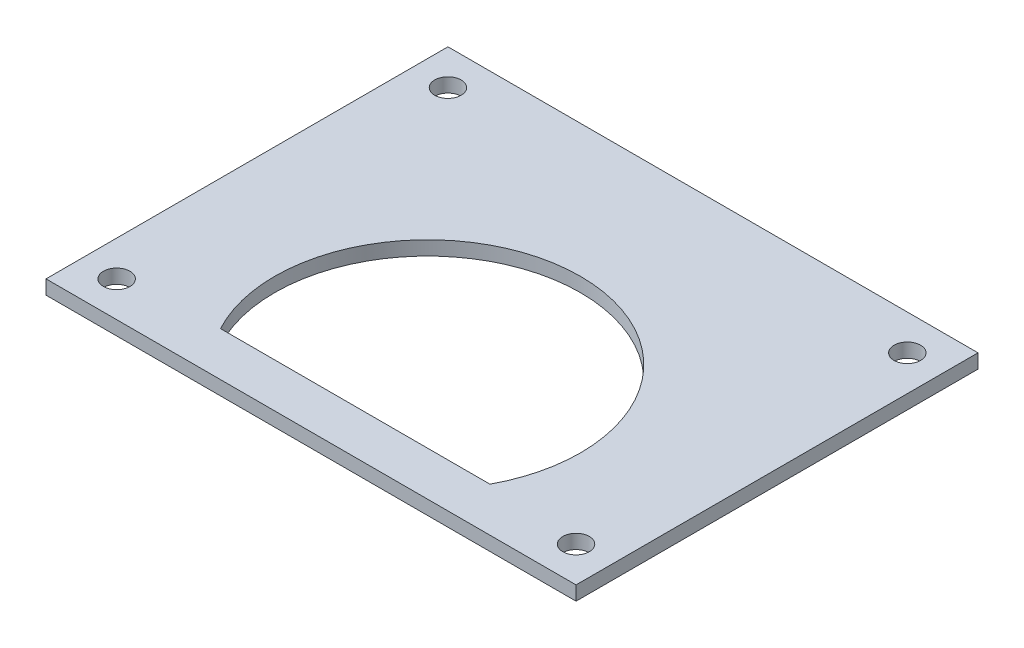
ISO-10303-21;
HEADER;
FILE_DESCRIPTION(('STEP AP214'),'2;1');
FILE_NAME('part.step','',(''),(''),'','','');
FILE_SCHEMA(('AUTOMOTIVE_DESIGN { 1 0 10303 214 1 1 1 1 }'));
ENDSEC;
DATA;
#1=APPLICATION_CONTEXT('core data for automotive mechanical design processes');
#2=APPLICATION_PROTOCOL_DEFINITION('international standard','automotive_design',2000,#1);
#3=PRODUCT_CONTEXT('',#1,'mechanical');
#4=PRODUCT('Part','Part','',(#3));
#5=PRODUCT_RELATED_PRODUCT_CATEGORY('part','',(#4));
#6=PRODUCT_DEFINITION_FORMATION('','',#4);
#7=PRODUCT_DEFINITION_CONTEXT('part definition',#1,'design');
#8=PRODUCT_DEFINITION('design','',#6,#7);
#9=PRODUCT_DEFINITION_SHAPE('','',#8);
#10=(LENGTH_UNIT() NAMED_UNIT(*) SI_UNIT(.MILLI.,.METRE.));
#11=(NAMED_UNIT(*) PLANE_ANGLE_UNIT() SI_UNIT($,.RADIAN.));
#12=(NAMED_UNIT(*) SI_UNIT($,.STERADIAN.) SOLID_ANGLE_UNIT());
#13=UNCERTAINTY_MEASURE_WITH_UNIT(LENGTH_MEASURE(1.E-05),#10,'distance_accuracy_value','');
#14=(GEOMETRIC_REPRESENTATION_CONTEXT(3) GLOBAL_UNCERTAINTY_ASSIGNED_CONTEXT((#13)) GLOBAL_UNIT_ASSIGNED_CONTEXT((#10,
#11,#12)) REPRESENTATION_CONTEXT('',''));
#15=CARTESIAN_POINT('',(0.,0.,0.));
#16=DIRECTION('',(0.,0.,1.));
#17=DIRECTION('',(1.,0.,0.));
#18=AXIS2_PLACEMENT_3D('',#15,#16,#17);
#19=CARTESIAN_POINT('',(0.,1.6,0.));
#20=DIRECTION('',(0.,-1.,0.));
#21=DIRECTION('',(0.,0.,-1.));
#22=AXIS2_PLACEMENT_3D('',#19,#20,#21);
#23=PLANE('',#22);
#24=DIRECTION('',(0.,0.,-1.));
#25=VECTOR('',#24,1.);
#26=CARTESIAN_POINT('',(30.,1.6,13.1899509803922));
#27=LINE('',#26,#25);
#28=CARTESIAN_POINT('',(30.,1.6,13.1899509803922));
#29=VERTEX_POINT('',#28);
#30=CARTESIAN_POINT('',(30.,1.6,-32.3100490196078));
#31=VERTEX_POINT('',#30);
#32=EDGE_CURVE('E107',#29,#31,#27,.T.);
#33=ORIENTED_EDGE('',*,*,#32,.T.);
#34=DIRECTION('',(-1.,0.,0.));
#35=VECTOR('',#34,1.);
#36=CARTESIAN_POINT('',(-30.,1.6,-32.3100490196078));
#37=LINE('',#36,#35);
#38=CARTESIAN_POINT('',(-30.,1.6,-32.3100490196078));
#39=VERTEX_POINT('',#38);
#40=EDGE_CURVE('E110',#31,#39,#37,.T.);
#41=ORIENTED_EDGE('',*,*,#40,.T.);
#42=DIRECTION('',(0.,0.,1.));
#43=VECTOR('',#42,1.);
#44=CARTESIAN_POINT('',(-30.,1.6,13.1899509803922));
#45=LINE('',#44,#43);
#46=CARTESIAN_POINT('',(-30.,1.6,13.1899509803922));
#47=VERTEX_POINT('',#46);
#48=EDGE_CURVE('E113',#39,#47,#45,.T.);
#49=ORIENTED_EDGE('',*,*,#48,.T.);
#50=DIRECTION('',(1.,0.,0.));
#51=VECTOR('',#50,1.);
#52=CARTESIAN_POINT('',(-30.,1.6,13.1899509803922));
#53=LINE('',#52,#51);
#54=EDGE_CURVE('E115',#47,#29,#53,.T.);
#55=ORIENTED_EDGE('',*,*,#54,.T.);
#56=EDGE_LOOP('',(#33,#41,#49,#55));
#57=FACE_BOUND('',#56,.T.);
#58=CARTESIAN_POINT('',(0.,1.6,0.));
#59=DIRECTION('',(0.,1.,0.));
#60=DIRECTION('',(0.,0.,-1.));
#61=AXIS2_PLACEMENT_3D('',#58,#59,#60);
#62=CIRCLE('',#61,17.3100490196078);
#63=CARTESIAN_POINT('',(15.25,1.6,8.18995098039215));
#64=VERTEX_POINT('',#63);
#65=CARTESIAN_POINT('',(-15.25,1.6,8.18995098039215));
#66=VERTEX_POINT('',#65);
#67=EDGE_CURVE('E91',#64,#66,#62,.T.);
#68=ORIENTED_EDGE('',*,*,#67,.F.);
#69=DIRECTION('',(1.,0.,0.));
#70=VECTOR('',#69,1.);
#71=CARTESIAN_POINT('',(-15.25,1.6,8.18995098039215));
#72=LINE('',#71,#70);
#73=EDGE_CURVE('E85',#66,#64,#72,.T.);
#74=ORIENTED_EDGE('',*,*,#73,.F.);
#75=EDGE_LOOP('',(#68,#74));
#76=FACE_BOUND('',#75,.T.);
#77=CARTESIAN_POINT('',(-26.,1.6,-28.3100490196078));
#78=DIRECTION('',(0.,1.,0.));
#79=DIRECTION('',(0.,0.,1.));
#80=AXIS2_PLACEMENT_3D('',#77,#78,#79);
#81=CIRCLE('',#80,1.5);
#82=CARTESIAN_POINT('',(-26.,1.6,-26.8100490196078));
#83=VERTEX_POINT('',#82);
#84=EDGE_CURVE('E103',#83,#83,#81,.T.);
#85=ORIENTED_EDGE('',*,*,#84,.F.);
#86=EDGE_LOOP('',(#85));
#87=FACE_BOUND('',#86,.T.);
#88=CARTESIAN_POINT('',(26.,1.6,-28.3100490196078));
#89=DIRECTION('',(0.,1.,0.));
#90=DIRECTION('',(0.,0.,1.));
#91=AXIS2_PLACEMENT_3D('',#88,#89,#90);
#92=CIRCLE('',#91,1.5);
#93=CARTESIAN_POINT('',(26.,1.6,-26.8100490196078));
#94=VERTEX_POINT('',#93);
#95=EDGE_CURVE('E212',#94,#94,#92,.T.);
#96=ORIENTED_EDGE('',*,*,#95,.F.);
#97=EDGE_LOOP('',(#96));
#98=FACE_BOUND('',#97,.T.);
#99=CARTESIAN_POINT('',(-26.,1.6,9.18995098039215));
#100=DIRECTION('',(0.,1.,0.));
#101=DIRECTION('',(0.,0.,1.));
#102=AXIS2_PLACEMENT_3D('',#99,#100,#101);
#103=CIRCLE('',#102,1.5);
#104=CARTESIAN_POINT('',(-26.,1.6,10.6899509803922));
#105=VERTEX_POINT('',#104);
#106=EDGE_CURVE('E206',#105,#105,#103,.T.);
#107=ORIENTED_EDGE('',*,*,#106,.F.);
#108=EDGE_LOOP('',(#107));
#109=FACE_BOUND('',#108,.T.);
#110=CARTESIAN_POINT('',(26.,1.6,9.18995098039215));
#111=DIRECTION('',(0.,1.,0.));
#112=DIRECTION('',(0.,0.,1.));
#113=AXIS2_PLACEMENT_3D('',#110,#111,#112);
#114=CIRCLE('',#113,1.5);
#115=CARTESIAN_POINT('',(26.,1.6,10.6899509803922));
#116=VERTEX_POINT('',#115);
#117=EDGE_CURVE('E197',#116,#116,#114,.T.);
#118=ORIENTED_EDGE('',*,*,#117,.F.);
#119=EDGE_LOOP('',(#118));
#120=FACE_BOUND('',#119,.T.);
#121=ADVANCED_FACE('F33',(#57,#76,#87,#98,#109,#120),#23,.F.);
#122=CARTESIAN_POINT('',(0.,0.,0.));
#123=DIRECTION('',(0.,-1.,0.));
#124=DIRECTION('',(0.,0.,-1.));
#125=AXIS2_PLACEMENT_3D('',#122,#123,#124);
#126=PLANE('',#125);
#127=CARTESIAN_POINT('',(-26.,0.,9.18995098039215));
#128=DIRECTION('',(0.,1.,0.));
#129=DIRECTION('',(0.,0.,1.));
#130=AXIS2_PLACEMENT_3D('',#127,#128,#129);
#131=CIRCLE('',#130,1.5);
#132=CARTESIAN_POINT('',(-26.,0.,10.6899509803922));
#133=VERTEX_POINT('',#132);
#134=EDGE_CURVE('E203',#133,#133,#131,.T.);
#135=ORIENTED_EDGE('',*,*,#134,.T.);
#136=EDGE_LOOP('',(#135));
#137=FACE_BOUND('',#136,.T.);
#138=CARTESIAN_POINT('',(-26.,0.,-28.3100490196078));
#139=DIRECTION('',(0.,1.,0.));
#140=DIRECTION('',(0.,0.,1.));
#141=AXIS2_PLACEMENT_3D('',#138,#139,#140);
#142=CIRCLE('',#141,1.5);
#143=CARTESIAN_POINT('',(-26.,0.,-26.8100490196078));
#144=VERTEX_POINT('',#143);
#145=EDGE_CURVE('E100',#144,#144,#142,.T.);
#146=ORIENTED_EDGE('',*,*,#145,.T.);
#147=EDGE_LOOP('',(#146));
#148=FACE_BOUND('',#147,.T.);
#149=DIRECTION('',(0.,0.,-1.));
#150=VECTOR('',#149,1.);
#151=CARTESIAN_POINT('',(30.,0.,13.1899509803922));
#152=LINE('',#151,#150);
#153=CARTESIAN_POINT('',(30.,0.,13.1899509803922));
#154=VERTEX_POINT('',#153);
#155=CARTESIAN_POINT('',(30.,0.,-32.3100490196078));
#156=VERTEX_POINT('',#155);
#157=EDGE_CURVE('E106',#154,#156,#152,.T.);
#158=ORIENTED_EDGE('',*,*,#157,.F.);
#159=DIRECTION('',(1.,0.,0.));
#160=VECTOR('',#159,1.);
#161=CARTESIAN_POINT('',(-30.,0.,13.1899509803922));
#162=LINE('',#161,#160);
#163=CARTESIAN_POINT('',(-30.,0.,13.1899509803922));
#164=VERTEX_POINT('',#163);
#165=EDGE_CURVE('E111',#164,#154,#162,.T.);
#166=ORIENTED_EDGE('',*,*,#165,.F.);
#167=DIRECTION('',(0.,0.,1.));
#168=VECTOR('',#167,1.);
#169=CARTESIAN_POINT('',(-30.,0.,13.1899509803922));
#170=LINE('',#169,#168);
#171=CARTESIAN_POINT('',(-30.,0.,-32.3100490196078));
#172=VERTEX_POINT('',#171);
#173=EDGE_CURVE('E122',#172,#164,#170,.T.);
#174=ORIENTED_EDGE('',*,*,#173,.F.);
#175=DIRECTION('',(-1.,0.,0.));
#176=VECTOR('',#175,1.);
#177=CARTESIAN_POINT('',(-30.,0.,-32.3100490196078));
#178=LINE('',#177,#176);
#179=EDGE_CURVE('E120',#156,#172,#178,.T.);
#180=ORIENTED_EDGE('',*,*,#179,.F.);
#181=EDGE_LOOP('',(#158,#166,#174,#180));
#182=FACE_BOUND('',#181,.T.);
#183=DIRECTION('',(1.,0.,0.));
#184=VECTOR('',#183,1.);
#185=CARTESIAN_POINT('',(-15.25,0.,8.18995098039215));
#186=LINE('',#185,#184);
#187=CARTESIAN_POINT('',(-15.25,0.,8.18995098039215));
#188=VERTEX_POINT('',#187);
#189=CARTESIAN_POINT('',(15.25,0.,8.18995098039215));
#190=VERTEX_POINT('',#189);
#191=EDGE_CURVE('E96',#188,#190,#186,.T.);
#192=ORIENTED_EDGE('',*,*,#191,.T.);
#193=CARTESIAN_POINT('',(0.,0.,0.));
#194=DIRECTION('',(0.,1.,0.));
#195=DIRECTION('',(0.,0.,-1.));
#196=AXIS2_PLACEMENT_3D('',#193,#194,#195);
#197=CIRCLE('',#196,17.3100490196078);
#198=EDGE_CURVE('E55',#190,#188,#197,.T.);
#199=ORIENTED_EDGE('',*,*,#198,.T.);
#200=EDGE_LOOP('',(#192,#199));
#201=FACE_BOUND('',#200,.T.);
#202=CARTESIAN_POINT('',(26.,0.,-28.3100490196078));
#203=DIRECTION('',(0.,1.,0.));
#204=DIRECTION('',(0.,0.,1.));
#205=AXIS2_PLACEMENT_3D('',#202,#203,#204);
#206=CIRCLE('',#205,1.5);
#207=CARTESIAN_POINT('',(26.,0.,-26.8100490196078));
#208=VERTEX_POINT('',#207);
#209=EDGE_CURVE('E209',#208,#208,#206,.T.);
#210=ORIENTED_EDGE('',*,*,#209,.T.);
#211=EDGE_LOOP('',(#210));
#212=FACE_BOUND('',#211,.T.);
#213=CARTESIAN_POINT('',(26.,0.,9.18995098039215));
#214=DIRECTION('',(0.,1.,0.));
#215=DIRECTION('',(0.,0.,1.));
#216=AXIS2_PLACEMENT_3D('',#213,#214,#215);
#217=CIRCLE('',#216,1.5);
#218=CARTESIAN_POINT('',(26.,0.,10.6899509803922));
#219=VERTEX_POINT('',#218);
#220=EDGE_CURVE('E200',#219,#219,#217,.T.);
#221=ORIENTED_EDGE('',*,*,#220,.T.);
#222=EDGE_LOOP('',(#221));
#223=FACE_BOUND('',#222,.T.);
#224=ADVANCED_FACE('F140',(#137,#148,#182,#201,#212,#223),#126,.T.);
#225=CARTESIAN_POINT('',(30.,1.6,13.1899509803922));
#226=DIRECTION('',(-1.,0.,0.));
#227=DIRECTION('',(0.,0.,1.));
#228=AXIS2_PLACEMENT_3D('',#225,#226,#227);
#229=PLANE('',#228);
#230=ORIENTED_EDGE('',*,*,#157,.T.);
#231=DIRECTION('',(0.,-1.,0.));
#232=VECTOR('',#231,1.);
#233=CARTESIAN_POINT('',(30.,1.6,-32.3100490196078));
#234=LINE('',#233,#232);
#235=EDGE_CURVE('E11',#31,#156,#234,.T.);
#236=ORIENTED_EDGE('',*,*,#235,.F.);
#237=ORIENTED_EDGE('',*,*,#32,.F.);
#238=DIRECTION('',(0.,-1.,0.));
#239=VECTOR('',#238,1.);
#240=CARTESIAN_POINT('',(30.,1.6,13.1899509803922));
#241=LINE('',#240,#239);
#242=EDGE_CURVE('E117',#29,#154,#241,.T.);
#243=ORIENTED_EDGE('',*,*,#242,.T.);
#244=EDGE_LOOP('',(#230,#236,#237,#243));
#245=FACE_BOUND('',#244,.T.);
#246=ADVANCED_FACE('F35',(#245),#229,.F.);
#247=CARTESIAN_POINT('',(-30.,1.6,-32.3100490196078));
#248=DIRECTION('',(0.,0.,1.));
#249=DIRECTION('',(1.,0.,0.));
#250=AXIS2_PLACEMENT_3D('',#247,#248,#249);
#251=PLANE('',#250);
#252=ORIENTED_EDGE('',*,*,#179,.T.);
#253=DIRECTION('',(0.,-1.,0.));
#254=VECTOR('',#253,1.);
#255=CARTESIAN_POINT('',(-30.,1.6,-32.3100490196078));
#256=LINE('',#255,#254);
#257=EDGE_CURVE('E41',#39,#172,#256,.T.);
#258=ORIENTED_EDGE('',*,*,#257,.F.);
#259=ORIENTED_EDGE('',*,*,#40,.F.);
#260=ORIENTED_EDGE('',*,*,#235,.T.);
#261=EDGE_LOOP('',(#252,#258,#259,#260));
#262=FACE_BOUND('',#261,.T.);
#263=ADVANCED_FACE('F150',(#262),#251,.F.);
#264=CARTESIAN_POINT('',(-30.,1.6,13.1899509803922));
#265=DIRECTION('',(1.,0.,0.));
#266=DIRECTION('',(0.,0.,-1.));
#267=AXIS2_PLACEMENT_3D('',#264,#265,#266);
#268=PLANE('',#267);
#269=ORIENTED_EDGE('',*,*,#173,.T.);
#270=DIRECTION('',(0.,-1.,0.));
#271=VECTOR('',#270,1.);
#272=CARTESIAN_POINT('',(-30.,1.6,13.1899509803922));
#273=LINE('',#272,#271);
#274=EDGE_CURVE('E127',#47,#164,#273,.T.);
#275=ORIENTED_EDGE('',*,*,#274,.F.);
#276=ORIENTED_EDGE('',*,*,#48,.F.);
#277=ORIENTED_EDGE('',*,*,#257,.T.);
#278=EDGE_LOOP('',(#269,#275,#276,#277));
#279=FACE_BOUND('',#278,.T.);
#280=ADVANCED_FACE('F134',(#279),#268,.F.);
#281=CARTESIAN_POINT('',(-30.,1.6,13.1899509803922));
#282=DIRECTION('',(0.,0.,-1.));
#283=DIRECTION('',(-1.,0.,0.));
#284=AXIS2_PLACEMENT_3D('',#281,#282,#283);
#285=PLANE('',#284);
#286=ORIENTED_EDGE('',*,*,#165,.T.);
#287=ORIENTED_EDGE('',*,*,#242,.F.);
#288=ORIENTED_EDGE('',*,*,#54,.F.);
#289=ORIENTED_EDGE('',*,*,#274,.T.);
#290=EDGE_LOOP('',(#286,#287,#288,#289));
#291=FACE_BOUND('',#290,.T.);
#292=ADVANCED_FACE('F144',(#291),#285,.F.);
#293=CARTESIAN_POINT('',(0.,1.6,0.));
#294=DIRECTION('',(0.,-1.,0.));
#295=DIRECTION('',(0.,0.,-1.));
#296=AXIS2_PLACEMENT_3D('',#293,#294,#295);
#297=CYLINDRICAL_SURFACE('',#296,17.3100490196078);
#298=ORIENTED_EDGE('',*,*,#198,.F.);
#299=DIRECTION('',(0.,-1.,0.));
#300=VECTOR('',#299,1.);
#301=CARTESIAN_POINT('',(15.25,1.6,8.18995098039215));
#302=LINE('',#301,#300);
#303=EDGE_CURVE('E87',#64,#190,#302,.T.);
#304=ORIENTED_EDGE('',*,*,#303,.F.);
#305=ORIENTED_EDGE('',*,*,#67,.T.);
#306=DIRECTION('',(0.,-1.,0.));
#307=VECTOR('',#306,1.);
#308=CARTESIAN_POINT('',(-15.25,1.6,8.18995098039215));
#309=LINE('',#308,#307);
#310=EDGE_CURVE('E48',#66,#188,#309,.T.);
#311=ORIENTED_EDGE('',*,*,#310,.T.);
#312=EDGE_LOOP('',(#298,#304,#305,#311));
#313=FACE_BOUND('',#312,.T.);
#314=ADVANCED_FACE('F93',(#313),#297,.F.);
#315=CARTESIAN_POINT('',(-15.25,1.6,8.18995098039215));
#316=DIRECTION('',(0.,0.,-1.));
#317=DIRECTION('',(-1.,0.,0.));
#318=AXIS2_PLACEMENT_3D('',#315,#316,#317);
#319=PLANE('',#318);
#320=ORIENTED_EDGE('',*,*,#191,.F.);
#321=ORIENTED_EDGE('',*,*,#310,.F.);
#322=ORIENTED_EDGE('',*,*,#73,.T.);
#323=ORIENTED_EDGE('',*,*,#303,.T.);
#324=EDGE_LOOP('',(#320,#321,#322,#323));
#325=FACE_BOUND('',#324,.T.);
#326=ADVANCED_FACE('F86',(#325),#319,.T.);
#327=CARTESIAN_POINT('',(-26.,1.6,-28.3100490196078));
#328=DIRECTION('',(0.,-1.,0.));
#329=DIRECTION('',(0.,0.,-1.));
#330=AXIS2_PLACEMENT_3D('',#327,#328,#329);
#331=CYLINDRICAL_SURFACE('',#330,1.5);
#332=ORIENTED_EDGE('',*,*,#84,.T.);
#333=EDGE_LOOP('',(#332));
#334=FACE_BOUND('',#333,.T.);
#335=ORIENTED_EDGE('',*,*,#145,.F.);
#336=EDGE_LOOP('',(#335));
#337=FACE_BOUND('',#336,.T.);
#338=ADVANCED_FACE('F174',(#334,#337),#331,.F.);
#339=CARTESIAN_POINT('',(26.,1.6,-28.3100490196078));
#340=DIRECTION('',(0.,-1.,0.));
#341=DIRECTION('',(0.,0.,-1.));
#342=AXIS2_PLACEMENT_3D('',#339,#340,#341);
#343=CYLINDRICAL_SURFACE('',#342,1.5);
#344=ORIENTED_EDGE('',*,*,#95,.T.);
#345=EDGE_LOOP('',(#344));
#346=FACE_BOUND('',#345,.T.);
#347=ORIENTED_EDGE('',*,*,#209,.F.);
#348=EDGE_LOOP('',(#347));
#349=FACE_BOUND('',#348,.T.);
#350=ADVANCED_FACE('F178',(#346,#349),#343,.F.);
#351=CARTESIAN_POINT('',(-26.,1.6,9.18995098039215));
#352=DIRECTION('',(0.,-1.,0.));
#353=DIRECTION('',(0.,0.,-1.));
#354=AXIS2_PLACEMENT_3D('',#351,#352,#353);
#355=CYLINDRICAL_SURFACE('',#354,1.5);
#356=ORIENTED_EDGE('',*,*,#106,.T.);
#357=EDGE_LOOP('',(#356));
#358=FACE_BOUND('',#357,.T.);
#359=ORIENTED_EDGE('',*,*,#134,.F.);
#360=EDGE_LOOP('',(#359));
#361=FACE_BOUND('',#360,.T.);
#362=ADVANCED_FACE('F184',(#358,#361),#355,.F.);
#363=CARTESIAN_POINT('',(26.,1.6,9.18995098039215));
#364=DIRECTION('',(0.,-1.,0.));
#365=DIRECTION('',(0.,0.,-1.));
#366=AXIS2_PLACEMENT_3D('',#363,#364,#365);
#367=CYLINDRICAL_SURFACE('',#366,1.5);
#368=ORIENTED_EDGE('',*,*,#117,.T.);
#369=EDGE_LOOP('',(#368));
#370=FACE_BOUND('',#369,.T.);
#371=ORIENTED_EDGE('',*,*,#220,.F.);
#372=EDGE_LOOP('',(#371));
#373=FACE_BOUND('',#372,.T.);
#374=ADVANCED_FACE('F188',(#370,#373),#367,.F.);
#375=CLOSED_SHELL('',(#121,#224,#246,#263,#280,#292,#314,#326,#338,#350,#362,#374));
#376=MANIFOLD_SOLID_BREP('B2',#375);
#377=ADVANCED_BREP_SHAPE_REPRESENTATION('',(#18,#376),#14);
#378=SHAPE_DEFINITION_REPRESENTATION(#9,#377);
ENDSEC;
END-ISO-10303-21;
